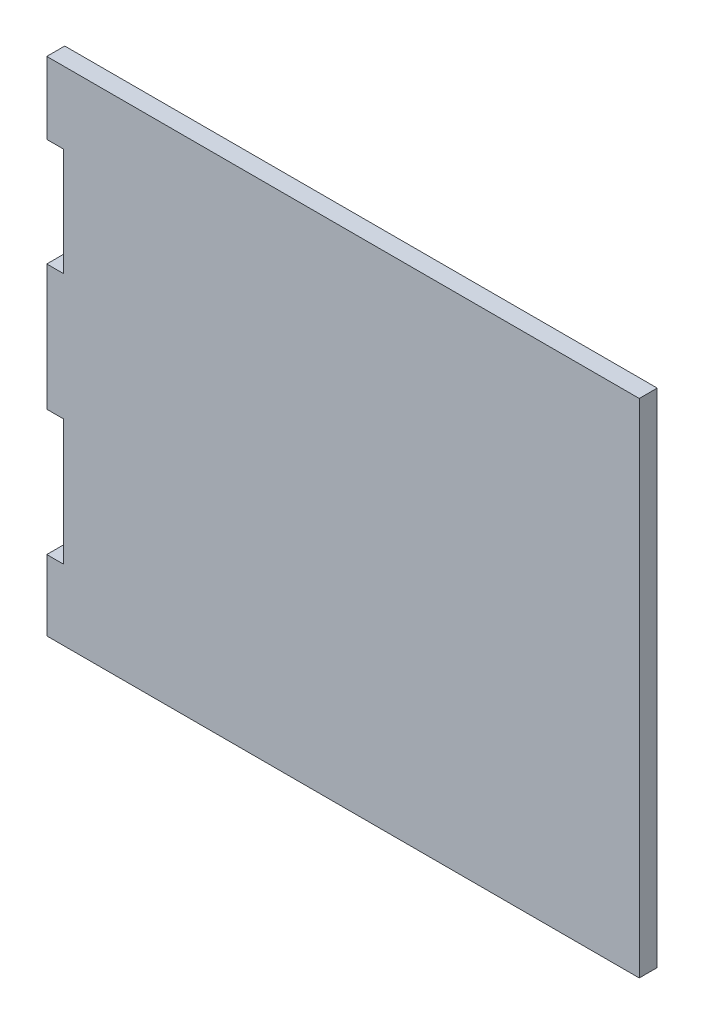
ISO-10303-21;
HEADER;
FILE_DESCRIPTION(('STEP AP214'),'2;1');
FILE_NAME('part.step','',(''),(''),'','','');
FILE_SCHEMA(('AUTOMOTIVE_DESIGN { 1 0 10303 214 1 1 1 1 }'));
ENDSEC;
DATA;
#1=APPLICATION_CONTEXT('core data for automotive mechanical design processes');
#2=APPLICATION_PROTOCOL_DEFINITION('international standard','automotive_design',2000,#1);
#3=PRODUCT_CONTEXT('',#1,'mechanical');
#4=PRODUCT('Part','Part','',(#3));
#5=PRODUCT_RELATED_PRODUCT_CATEGORY('part','',(#4));
#6=PRODUCT_DEFINITION_FORMATION('','',#4);
#7=PRODUCT_DEFINITION_CONTEXT('part definition',#1,'design');
#8=PRODUCT_DEFINITION('design','',#6,#7);
#9=PRODUCT_DEFINITION_SHAPE('','',#8);
#10=(LENGTH_UNIT() NAMED_UNIT(*) SI_UNIT(.MILLI.,.METRE.));
#11=(NAMED_UNIT(*) PLANE_ANGLE_UNIT() SI_UNIT($,.RADIAN.));
#12=(NAMED_UNIT(*) SI_UNIT($,.STERADIAN.) SOLID_ANGLE_UNIT());
#13=UNCERTAINTY_MEASURE_WITH_UNIT(LENGTH_MEASURE(1.E-05),#10,'distance_accuracy_value','');
#14=(GEOMETRIC_REPRESENTATION_CONTEXT(3) GLOBAL_UNCERTAINTY_ASSIGNED_CONTEXT((#13)) GLOBAL_UNIT_ASSIGNED_CONTEXT((#10,
#11,#12)) REPRESENTATION_CONTEXT('',''));
#15=CARTESIAN_POINT('',(0.,0.,0.));
#16=DIRECTION('',(0.,0.,1.));
#17=DIRECTION('',(1.,0.,0.));
#18=AXIS2_PLACEMENT_3D('',#15,#16,#17);
#19=CARTESIAN_POINT('',(104.434,-82.6482,6.35));
#20=DIRECTION('',(-1.,0.,0.));
#21=DIRECTION('',(0.,0.,1.));
#22=AXIS2_PLACEMENT_3D('',#19,#20,#21);
#23=PLANE('',#22);
#24=DIRECTION('',(0.,1.,0.));
#25=VECTOR('',#24,1.);
#26=CARTESIAN_POINT('',(104.434,-82.6482,0.));
#27=LINE('',#26,#25);
#28=CARTESIAN_POINT('',(104.434,-82.6482,0.));
#29=VERTEX_POINT('',#28);
#30=CARTESIAN_POINT('',(104.434,94.6585,0.));
#31=VERTEX_POINT('',#30);
#32=EDGE_CURVE('E152',#29,#31,#27,.T.);
#33=ORIENTED_EDGE('',*,*,#32,.T.);
#34=DIRECTION('',(0.,0.,-1.));
#35=VECTOR('',#34,1.);
#36=CARTESIAN_POINT('',(104.434,94.6585,6.35));
#37=LINE('',#36,#35);
#38=CARTESIAN_POINT('',(104.434,94.6585,6.35));
#39=VERTEX_POINT('',#38);
#40=EDGE_CURVE('E11',#39,#31,#37,.T.);
#41=ORIENTED_EDGE('',*,*,#40,.F.);
#42=DIRECTION('',(0.,1.,0.));
#43=VECTOR('',#42,1.);
#44=CARTESIAN_POINT('',(104.434,-82.6482,6.35));
#45=LINE('',#44,#43);
#46=CARTESIAN_POINT('',(104.434,-82.6482,6.35));
#47=VERTEX_POINT('',#46);
#48=EDGE_CURVE('E174',#47,#39,#45,.T.);
#49=ORIENTED_EDGE('',*,*,#48,.F.);
#50=DIRECTION('',(0.,0.,-1.));
#51=VECTOR('',#50,1.);
#52=CARTESIAN_POINT('',(104.434,-82.6482,6.35));
#53=LINE('',#52,#51);
#54=EDGE_CURVE('E148',#47,#29,#53,.T.);
#55=ORIENTED_EDGE('',*,*,#54,.T.);
#56=EDGE_LOOP('',(#33,#41,#49,#55));
#57=FACE_BOUND('',#56,.T.);
#58=ADVANCED_FACE('F32',(#57),#23,.F.);
#59=CARTESIAN_POINT('',(104.434,94.6585,6.35));
#60=DIRECTION('',(0.,-1.,0.));
#61=DIRECTION('',(0.,0.,-1.));
#62=AXIS2_PLACEMENT_3D('',#59,#60,#61);
#63=PLANE('',#62);
#64=DIRECTION('',(-1.,0.,0.));
#65=VECTOR('',#64,1.);
#66=CARTESIAN_POINT('',(104.434,94.6585,0.));
#67=LINE('',#66,#65);
#68=CARTESIAN_POINT('',(-104.8687,94.6585,0.));
#69=VERTEX_POINT('',#68);
#70=EDGE_CURVE('E155',#31,#69,#67,.T.);
#71=ORIENTED_EDGE('',*,*,#70,.T.);
#72=DIRECTION('',(0.,0.,-1.));
#73=VECTOR('',#72,1.);
#74=CARTESIAN_POINT('',(-104.8687,94.6585,6.35));
#75=LINE('',#74,#73);
#76=CARTESIAN_POINT('',(-104.8687,94.6585,6.35));
#77=VERTEX_POINT('',#76);
#78=EDGE_CURVE('E40',#77,#69,#75,.T.);
#79=ORIENTED_EDGE('',*,*,#78,.F.);
#80=DIRECTION('',(-1.,0.,0.));
#81=VECTOR('',#80,1.);
#82=CARTESIAN_POINT('',(104.434,94.6585,6.35));
#83=LINE('',#82,#81);
#84=EDGE_CURVE('E103',#39,#77,#83,.T.);
#85=ORIENTED_EDGE('',*,*,#84,.F.);
#86=ORIENTED_EDGE('',*,*,#40,.T.);
#87=EDGE_LOOP('',(#71,#79,#85,#86));
#88=FACE_BOUND('',#87,.T.);
#89=ADVANCED_FACE('F252',(#88),#63,.F.);
#90=CARTESIAN_POINT('',(-104.8687,94.6585,6.35));
#91=DIRECTION('',(1.,0.,0.));
#92=DIRECTION('',(0.,0.,-1.));
#93=AXIS2_PLACEMENT_3D('',#90,#91,#92);
#94=PLANE('',#93);
#95=DIRECTION('',(0.,-1.,0.));
#96=VECTOR('',#95,1.);
#97=CARTESIAN_POINT('',(-104.8687,94.6585,0.));
#98=LINE('',#97,#96);
#99=CARTESIAN_POINT('',(-104.8687,69.2585,0.));
#100=VERTEX_POINT('',#99);
#101=EDGE_CURVE('E157',#69,#100,#98,.T.);
#102=ORIENTED_EDGE('',*,*,#101,.T.);
#103=DIRECTION('',(0.,0.,-1.));
#104=VECTOR('',#103,1.);
#105=CARTESIAN_POINT('',(-104.8687,69.2585,6.35));
#106=LINE('',#105,#104);
#107=CARTESIAN_POINT('',(-104.8687,69.2585,6.35));
#108=VERTEX_POINT('',#107);
#109=EDGE_CURVE('E193',#108,#100,#106,.T.);
#110=ORIENTED_EDGE('',*,*,#109,.F.);
#111=DIRECTION('',(0.,-1.,0.));
#112=VECTOR('',#111,1.);
#113=CARTESIAN_POINT('',(-104.8687,94.6585,6.35));
#114=LINE('',#113,#112);
#115=EDGE_CURVE('E201',#77,#108,#114,.T.);
#116=ORIENTED_EDGE('',*,*,#115,.F.);
#117=ORIENTED_EDGE('',*,*,#78,.T.);
#118=EDGE_LOOP('',(#102,#110,#116,#117));
#119=FACE_BOUND('',#118,.T.);
#120=ADVANCED_FACE('F199',(#119),#94,.F.);
#121=CARTESIAN_POINT('',(-104.8687,69.2585,6.35));
#122=DIRECTION('',(0.,1.,0.));
#123=DIRECTION('',(0.,0.,1.));
#124=AXIS2_PLACEMENT_3D('',#121,#122,#123);
#125=PLANE('',#124);
#126=DIRECTION('',(1.,0.,0.));
#127=VECTOR('',#126,1.);
#128=CARTESIAN_POINT('',(-104.8687,69.2585,0.));
#129=LINE('',#128,#127);
#130=CARTESIAN_POINT('',(-99.0122,69.2585,0.));
#131=VERTEX_POINT('',#130);
#132=EDGE_CURVE('E159',#100,#131,#129,.T.);
#133=ORIENTED_EDGE('',*,*,#132,.T.);
#134=DIRECTION('',(0.,0.,-1.));
#135=VECTOR('',#134,1.);
#136=CARTESIAN_POINT('',(-99.0122,69.2585,6.35));
#137=LINE('',#136,#135);
#138=CARTESIAN_POINT('',(-99.0122,69.2585,6.35));
#139=VERTEX_POINT('',#138);
#140=EDGE_CURVE('E190',#139,#131,#137,.T.);
#141=ORIENTED_EDGE('',*,*,#140,.F.);
#142=DIRECTION('',(1.,0.,0.));
#143=VECTOR('',#142,1.);
#144=CARTESIAN_POINT('',(-104.8687,69.2585,6.35));
#145=LINE('',#144,#143);
#146=EDGE_CURVE('E219',#108,#139,#145,.T.);
#147=ORIENTED_EDGE('',*,*,#146,.F.);
#148=ORIENTED_EDGE('',*,*,#109,.T.);
#149=EDGE_LOOP('',(#133,#141,#147,#148));
#150=FACE_BOUND('',#149,.T.);
#151=ADVANCED_FACE('F210',(#150),#125,.F.);
#152=CARTESIAN_POINT('',(-99.0122,69.2585,6.35));
#153=DIRECTION('',(1.,0.,0.));
#154=DIRECTION('',(0.,0.,-1.));
#155=AXIS2_PLACEMENT_3D('',#152,#153,#154);
#156=PLANE('',#155);
#157=DIRECTION('',(0.,-1.,0.));
#158=VECTOR('',#157,1.);
#159=CARTESIAN_POINT('',(-99.0122,69.2585,0.));
#160=LINE('',#159,#158);
#161=CARTESIAN_POINT('',(-99.0122,31.1585,0.));
#162=VERTEX_POINT('',#161);
#163=EDGE_CURVE('E161',#131,#162,#160,.T.);
#164=ORIENTED_EDGE('',*,*,#163,.T.);
#165=DIRECTION('',(0.,0.,-1.));
#166=VECTOR('',#165,1.);
#167=CARTESIAN_POINT('',(-99.0122,31.1585,6.35));
#168=LINE('',#167,#166);
#169=CARTESIAN_POINT('',(-99.0122,31.1585,6.35));
#170=VERTEX_POINT('',#169);
#171=EDGE_CURVE('E187',#170,#162,#168,.T.);
#172=ORIENTED_EDGE('',*,*,#171,.F.);
#173=DIRECTION('',(0.,-1.,0.));
#174=VECTOR('',#173,1.);
#175=CARTESIAN_POINT('',(-99.0122,69.2585,6.35));
#176=LINE('',#175,#174);
#177=EDGE_CURVE('E216',#139,#170,#176,.T.);
#178=ORIENTED_EDGE('',*,*,#177,.F.);
#179=ORIENTED_EDGE('',*,*,#140,.T.);
#180=EDGE_LOOP('',(#164,#172,#178,#179));
#181=FACE_BOUND('',#180,.T.);
#182=ADVANCED_FACE('F214',(#181),#156,.F.);
#183=CARTESIAN_POINT('',(-99.0122,31.1585,6.35));
#184=DIRECTION('',(0.,-1.,0.));
#185=DIRECTION('',(0.,0.,-1.));
#186=AXIS2_PLACEMENT_3D('',#183,#184,#185);
#187=PLANE('',#186);
#188=DIRECTION('',(-1.,0.,0.));
#189=VECTOR('',#188,1.);
#190=CARTESIAN_POINT('',(-99.0122,31.1585,0.));
#191=LINE('',#190,#189);
#192=CARTESIAN_POINT('',(-104.8687,31.1585,0.));
#193=VERTEX_POINT('',#192);
#194=EDGE_CURVE('E163',#162,#193,#191,.T.);
#195=ORIENTED_EDGE('',*,*,#194,.T.);
#196=DIRECTION('',(0.,0.,-1.));
#197=VECTOR('',#196,1.);
#198=CARTESIAN_POINT('',(-104.8687,31.1585,6.35));
#199=LINE('',#198,#197);
#200=CARTESIAN_POINT('',(-104.8687,31.1585,6.35));
#201=VERTEX_POINT('',#200);
#202=EDGE_CURVE('E184',#201,#193,#199,.T.);
#203=ORIENTED_EDGE('',*,*,#202,.F.);
#204=DIRECTION('',(-1.,0.,0.));
#205=VECTOR('',#204,1.);
#206=CARTESIAN_POINT('',(-99.0122,31.1585,6.35));
#207=LINE('',#206,#205);
#208=EDGE_CURVE('E218',#170,#201,#207,.T.);
#209=ORIENTED_EDGE('',*,*,#208,.F.);
#210=ORIENTED_EDGE('',*,*,#171,.T.);
#211=EDGE_LOOP('',(#195,#203,#209,#210));
#212=FACE_BOUND('',#211,.T.);
#213=ADVANCED_FACE('F265',(#212),#187,.F.);
#214=CARTESIAN_POINT('',(-104.8687,31.1585,6.35));
#215=DIRECTION('',(1.,0.,0.));
#216=DIRECTION('',(0.,0.,-1.));
#217=AXIS2_PLACEMENT_3D('',#214,#215,#216);
#218=PLANE('',#217);
#219=DIRECTION('',(0.,-1.,0.));
#220=VECTOR('',#219,1.);
#221=CARTESIAN_POINT('',(-104.8687,31.1585,0.));
#222=LINE('',#221,#220);
#223=CARTESIAN_POINT('',(-104.8687,-13.2915,0.));
#224=VERTEX_POINT('',#223);
#225=EDGE_CURVE('E165',#193,#224,#222,.T.);
#226=ORIENTED_EDGE('',*,*,#225,.T.);
#227=DIRECTION('',(0.,0.,-1.));
#228=VECTOR('',#227,1.);
#229=CARTESIAN_POINT('',(-104.8687,-13.2915,6.35));
#230=LINE('',#229,#228);
#231=CARTESIAN_POINT('',(-104.8687,-13.2915,6.35));
#232=VERTEX_POINT('',#231);
#233=EDGE_CURVE('E181',#232,#224,#230,.T.);
#234=ORIENTED_EDGE('',*,*,#233,.F.);
#235=DIRECTION('',(0.,-1.,0.));
#236=VECTOR('',#235,1.);
#237=CARTESIAN_POINT('',(-104.8687,31.1585,6.35));
#238=LINE('',#237,#236);
#239=EDGE_CURVE('E221',#201,#232,#238,.T.);
#240=ORIENTED_EDGE('',*,*,#239,.F.);
#241=ORIENTED_EDGE('',*,*,#202,.T.);
#242=EDGE_LOOP('',(#226,#234,#240,#241));
#243=FACE_BOUND('',#242,.T.);
#244=ADVANCED_FACE('F268',(#243),#218,.F.);
#245=CARTESIAN_POINT('',(-104.8687,-13.2915,6.35));
#246=DIRECTION('',(0.,1.,0.));
#247=DIRECTION('',(0.,0.,1.));
#248=AXIS2_PLACEMENT_3D('',#245,#246,#247);
#249=PLANE('',#248);
#250=DIRECTION('',(1.,0.,0.));
#251=VECTOR('',#250,1.);
#252=CARTESIAN_POINT('',(-104.8687,-13.2915,0.));
#253=LINE('',#252,#251);
#254=CARTESIAN_POINT('',(-99.0122,-13.2915,0.));
#255=VERTEX_POINT('',#254);
#256=EDGE_CURVE('E167',#224,#255,#253,.T.);
#257=ORIENTED_EDGE('',*,*,#256,.T.);
#258=DIRECTION('',(0.,0.,-1.));
#259=VECTOR('',#258,1.);
#260=CARTESIAN_POINT('',(-99.0122,-13.2915,6.35));
#261=LINE('',#260,#259);
#262=CARTESIAN_POINT('',(-99.0122,-13.2915,6.35));
#263=VERTEX_POINT('',#262);
#264=EDGE_CURVE('E178',#263,#255,#261,.T.);
#265=ORIENTED_EDGE('',*,*,#264,.F.);
#266=DIRECTION('',(1.,0.,0.));
#267=VECTOR('',#266,1.);
#268=CARTESIAN_POINT('',(-104.8687,-13.2915,6.35));
#269=LINE('',#268,#267);
#270=EDGE_CURVE('E227',#232,#263,#269,.T.);
#271=ORIENTED_EDGE('',*,*,#270,.F.);
#272=ORIENTED_EDGE('',*,*,#233,.T.);
#273=EDGE_LOOP('',(#257,#265,#271,#272));
#274=FACE_BOUND('',#273,.T.);
#275=ADVANCED_FACE('F233',(#274),#249,.F.);
#276=CARTESIAN_POINT('',(-99.0122,-13.2915,6.35));
#277=DIRECTION('',(1.,0.,0.));
#278=DIRECTION('',(0.,0.,-1.));
#279=AXIS2_PLACEMENT_3D('',#276,#277,#278);
#280=PLANE('',#279);
#281=DIRECTION('',(0.,-1.,0.));
#282=VECTOR('',#281,1.);
#283=CARTESIAN_POINT('',(-99.0122,-13.2915,0.));
#284=LINE('',#283,#282);
#285=CARTESIAN_POINT('',(-99.0122,-57.7414,0.));
#286=VERTEX_POINT('',#285);
#287=EDGE_CURVE('E169',#255,#286,#284,.T.);
#288=ORIENTED_EDGE('',*,*,#287,.T.);
#289=DIRECTION('',(0.,0.,-1.));
#290=VECTOR('',#289,1.);
#291=CARTESIAN_POINT('',(-99.0122,-57.7414,6.35));
#292=LINE('',#291,#290);
#293=CARTESIAN_POINT('',(-99.0122,-57.7414,6.35));
#294=VERTEX_POINT('',#293);
#295=EDGE_CURVE('E143',#294,#286,#292,.T.);
#296=ORIENTED_EDGE('',*,*,#295,.F.);
#297=DIRECTION('',(0.,-1.,0.));
#298=VECTOR('',#297,1.);
#299=CARTESIAN_POINT('',(-99.0122,-13.2915,6.35));
#300=LINE('',#299,#298);
#301=EDGE_CURVE('E134',#263,#294,#300,.T.);
#302=ORIENTED_EDGE('',*,*,#301,.F.);
#303=ORIENTED_EDGE('',*,*,#264,.T.);
#304=EDGE_LOOP('',(#288,#296,#302,#303));
#305=FACE_BOUND('',#304,.T.);
#306=ADVANCED_FACE('F237',(#305),#280,.F.);
#307=CARTESIAN_POINT('',(-99.0122,-57.7414,6.35));
#308=DIRECTION('',(0.,-1.,0.));
#309=DIRECTION('',(0.,0.,-1.));
#310=AXIS2_PLACEMENT_3D('',#307,#308,#309);
#311=PLANE('',#310);
#312=DIRECTION('',(-1.,0.,0.));
#313=VECTOR('',#312,1.);
#314=CARTESIAN_POINT('',(-99.0122,-57.7414,0.));
#315=LINE('',#314,#313);
#316=CARTESIAN_POINT('',(-104.8687,-57.7414,0.));
#317=VERTEX_POINT('',#316);
#318=EDGE_CURVE('E142',#286,#317,#315,.T.);
#319=ORIENTED_EDGE('',*,*,#318,.T.);
#320=DIRECTION('',(0.,0.,-1.));
#321=VECTOR('',#320,1.);
#322=CARTESIAN_POINT('',(-104.8687,-57.7414,6.35));
#323=LINE('',#322,#321);
#324=CARTESIAN_POINT('',(-104.8687,-57.7414,6.35));
#325=VERTEX_POINT('',#324);
#326=EDGE_CURVE('E139',#325,#317,#323,.T.);
#327=ORIENTED_EDGE('',*,*,#326,.F.);
#328=DIRECTION('',(-1.,0.,0.));
#329=VECTOR('',#328,1.);
#330=CARTESIAN_POINT('',(-99.0122,-57.7414,6.35));
#331=LINE('',#330,#329);
#332=EDGE_CURVE('E128',#294,#325,#331,.T.);
#333=ORIENTED_EDGE('',*,*,#332,.F.);
#334=ORIENTED_EDGE('',*,*,#295,.T.);
#335=EDGE_LOOP('',(#319,#327,#333,#334));
#336=FACE_BOUND('',#335,.T.);
#337=ADVANCED_FACE('F140',(#336),#311,.F.);
#338=CARTESIAN_POINT('',(-104.8687,-57.7414,6.35));
#339=DIRECTION('',(1.,0.,0.));
#340=DIRECTION('',(0.,0.,-1.));
#341=AXIS2_PLACEMENT_3D('',#338,#339,#340);
#342=PLANE('',#341);
#343=DIRECTION('',(0.,-1.,0.));
#344=VECTOR('',#343,1.);
#345=CARTESIAN_POINT('',(-104.8687,-57.7414,0.));
#346=LINE('',#345,#344);
#347=CARTESIAN_POINT('',(-104.8687,-82.6482,0.));
#348=VERTEX_POINT('',#347);
#349=EDGE_CURVE('E89',#317,#348,#346,.T.);
#350=ORIENTED_EDGE('',*,*,#349,.T.);
#351=DIRECTION('',(0.,0.,-1.));
#352=VECTOR('',#351,1.);
#353=CARTESIAN_POINT('',(-104.8687,-82.6482,6.35));
#354=LINE('',#353,#352);
#355=CARTESIAN_POINT('',(-104.8687,-82.6482,6.35));
#356=VERTEX_POINT('',#355);
#357=EDGE_CURVE('E144',#356,#348,#354,.T.);
#358=ORIENTED_EDGE('',*,*,#357,.F.);
#359=DIRECTION('',(0.,-1.,0.));
#360=VECTOR('',#359,1.);
#361=CARTESIAN_POINT('',(-104.8687,-57.7414,6.35));
#362=LINE('',#361,#360);
#363=EDGE_CURVE('E132',#325,#356,#362,.T.);
#364=ORIENTED_EDGE('',*,*,#363,.F.);
#365=ORIENTED_EDGE('',*,*,#326,.T.);
#366=EDGE_LOOP('',(#350,#358,#364,#365));
#367=FACE_BOUND('',#366,.T.);
#368=ADVANCED_FACE('F146',(#367),#342,.F.);
#369=CARTESIAN_POINT('',(-104.8687,-82.6482,6.35));
#370=DIRECTION('',(0.,1.,0.));
#371=DIRECTION('',(0.,0.,1.));
#372=AXIS2_PLACEMENT_3D('',#369,#370,#371);
#373=PLANE('',#372);
#374=DIRECTION('',(1.,0.,0.));
#375=VECTOR('',#374,1.);
#376=CARTESIAN_POINT('',(-104.8687,-82.6482,0.));
#377=LINE('',#376,#375);
#378=EDGE_CURVE('E95',#348,#29,#377,.T.);
#379=ORIENTED_EDGE('',*,*,#378,.T.);
#380=ORIENTED_EDGE('',*,*,#54,.F.);
#381=DIRECTION('',(1.,0.,0.));
#382=VECTOR('',#381,1.);
#383=CARTESIAN_POINT('',(-104.8687,-82.6482,6.35));
#384=LINE('',#383,#382);
#385=EDGE_CURVE('E48',#356,#47,#384,.T.);
#386=ORIENTED_EDGE('',*,*,#385,.F.);
#387=ORIENTED_EDGE('',*,*,#357,.T.);
#388=EDGE_LOOP('',(#379,#380,#386,#387));
#389=FACE_BOUND('',#388,.T.);
#390=ADVANCED_FACE('F241',(#389),#373,.F.);
#391=CARTESIAN_POINT('',(0.,0.,6.35));
#392=DIRECTION('',(0.,0.,1.));
#393=DIRECTION('',(1.,0.,0.));
#394=AXIS2_PLACEMENT_3D('',#391,#392,#393);
#395=PLANE('',#394);
#396=ORIENTED_EDGE('',*,*,#48,.T.);
#397=ORIENTED_EDGE('',*,*,#84,.T.);
#398=ORIENTED_EDGE('',*,*,#115,.T.);
#399=ORIENTED_EDGE('',*,*,#146,.T.);
#400=ORIENTED_EDGE('',*,*,#177,.T.);
#401=ORIENTED_EDGE('',*,*,#208,.T.);
#402=ORIENTED_EDGE('',*,*,#239,.T.);
#403=ORIENTED_EDGE('',*,*,#270,.T.);
#404=ORIENTED_EDGE('',*,*,#301,.T.);
#405=ORIENTED_EDGE('',*,*,#332,.T.);
#406=ORIENTED_EDGE('',*,*,#363,.T.);
#407=ORIENTED_EDGE('',*,*,#385,.T.);
#408=EDGE_LOOP('',(#396,#397,#398,#399,#400,#401,#402,#403,#404,#405,#406,#407));
#409=FACE_BOUND('',#408,.T.);
#410=ADVANCED_FACE('F130',(#409),#395,.T.);
#411=CARTESIAN_POINT('',(0.,0.,0.));
#412=DIRECTION('',(0.,0.,1.));
#413=DIRECTION('',(1.,0.,0.));
#414=AXIS2_PLACEMENT_3D('',#411,#412,#413);
#415=PLANE('',#414);
#416=ORIENTED_EDGE('',*,*,#32,.F.);
#417=ORIENTED_EDGE('',*,*,#378,.F.);
#418=ORIENTED_EDGE('',*,*,#349,.F.);
#419=ORIENTED_EDGE('',*,*,#318,.F.);
#420=ORIENTED_EDGE('',*,*,#287,.F.);
#421=ORIENTED_EDGE('',*,*,#256,.F.);
#422=ORIENTED_EDGE('',*,*,#225,.F.);
#423=ORIENTED_EDGE('',*,*,#194,.F.);
#424=ORIENTED_EDGE('',*,*,#163,.F.);
#425=ORIENTED_EDGE('',*,*,#132,.F.);
#426=ORIENTED_EDGE('',*,*,#101,.F.);
#427=ORIENTED_EDGE('',*,*,#70,.F.);
#428=EDGE_LOOP('',(#416,#417,#418,#419,#420,#421,#422,#423,#424,#425,#426,#427));
#429=FACE_BOUND('',#428,.T.);
#430=ADVANCED_FACE('F205',(#429),#415,.F.);
#431=CLOSED_SHELL('',(#58,#89,#120,#151,#182,#213,#244,#275,#306,#337,#368,#390,#410,#430));
#432=MANIFOLD_SOLID_BREP('B2',#431);
#433=ADVANCED_BREP_SHAPE_REPRESENTATION('',(#18,#432),#14);
#434=SHAPE_DEFINITION_REPRESENTATION(#9,#433);
ENDSEC;
END-ISO-10303-21;
